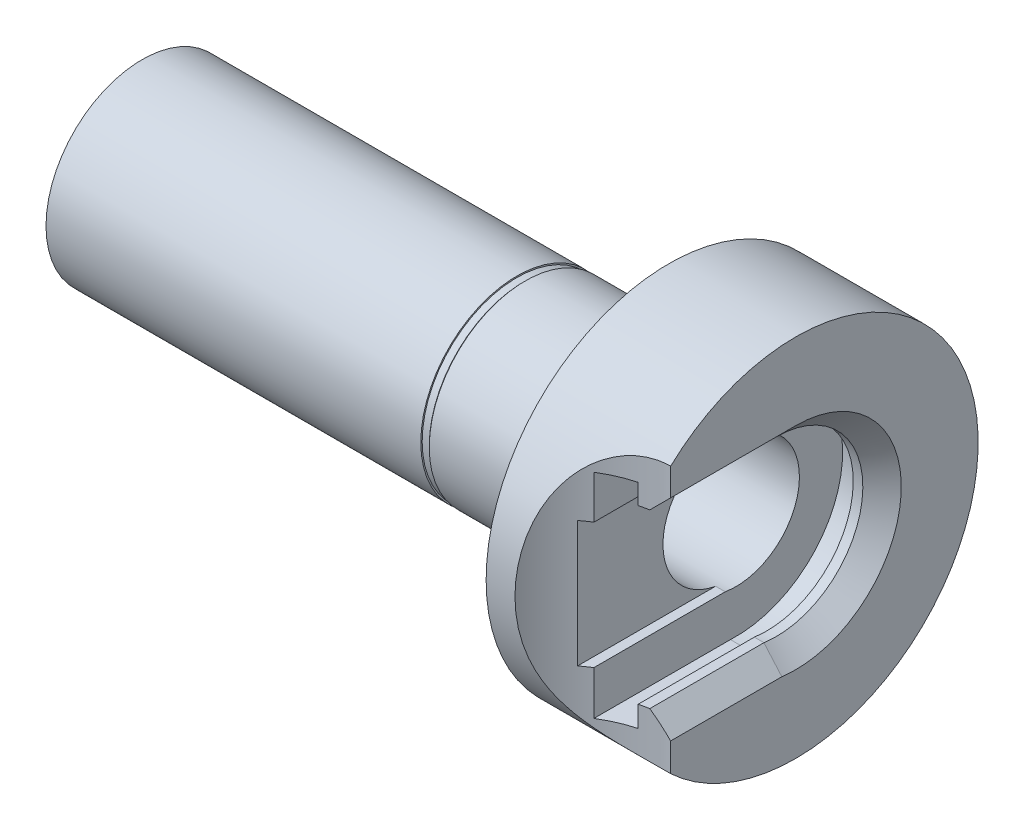
ISO-10303-21;
HEADER;
FILE_DESCRIPTION(('STEP AP214'),'2;1');
FILE_NAME('part.step','',(''),(''),'','','');
FILE_SCHEMA(('AUTOMOTIVE_DESIGN { 1 0 10303 214 1 1 1 1 }'));
ENDSEC;
DATA;
#1=APPLICATION_CONTEXT('core data for automotive mechanical design processes');
#2=APPLICATION_PROTOCOL_DEFINITION('international standard','automotive_design',2000,#1);
#3=PRODUCT_CONTEXT('',#1,'mechanical');
#4=PRODUCT('Part','Part','',(#3));
#5=PRODUCT_RELATED_PRODUCT_CATEGORY('part','',(#4));
#6=PRODUCT_DEFINITION_FORMATION('','',#4);
#7=PRODUCT_DEFINITION_CONTEXT('part definition',#1,'design');
#8=PRODUCT_DEFINITION('design','',#6,#7);
#9=PRODUCT_DEFINITION_SHAPE('','',#8);
#10=(LENGTH_UNIT() NAMED_UNIT(*) SI_UNIT(.MILLI.,.METRE.));
#11=(NAMED_UNIT(*) PLANE_ANGLE_UNIT() SI_UNIT($,.RADIAN.));
#12=(NAMED_UNIT(*) SI_UNIT($,.STERADIAN.) SOLID_ANGLE_UNIT());
#13=UNCERTAINTY_MEASURE_WITH_UNIT(LENGTH_MEASURE(1.E-05),#10,'distance_accuracy_value','');
#14=(GEOMETRIC_REPRESENTATION_CONTEXT(3) GLOBAL_UNCERTAINTY_ASSIGNED_CONTEXT((#13)) GLOBAL_UNIT_ASSIGNED_CONTEXT((#10,
#11,#12)) REPRESENTATION_CONTEXT('',''));
#15=CARTESIAN_POINT('',(0.,0.,0.));
#16=DIRECTION('',(0.,0.,1.));
#17=DIRECTION('',(1.,0.,0.));
#18=AXIS2_PLACEMENT_3D('',#15,#16,#17);
#19=CARTESIAN_POINT('',(0.,0.,0.));
#20=DIRECTION('',(-1.,0.,0.));
#21=DIRECTION('',(0.,0.,1.));
#22=AXIS2_PLACEMENT_3D('',#19,#20,#21);
#23=CYLINDRICAL_SURFACE('',#22,5.);
#24=CARTESIAN_POINT('',(20.5154591039939,0.,0.));
#25=DIRECTION('',(-1.,0.,0.));
#26=DIRECTION('',(0.,0.,1.));
#27=AXIS2_PLACEMENT_3D('',#24,#25,#26);
#28=CIRCLE('',#27,5.);
#29=CARTESIAN_POINT('',(20.5154591039939,0.,4.99999999999999));
#30=VERTEX_POINT('',#29);
#31=EDGE_CURVE('E188',#30,#30,#28,.T.);
#32=ORIENTED_EDGE('',*,*,#31,.T.);
#33=EDGE_LOOP('',(#32));
#34=FACE_BOUND('',#33,.T.);
#35=CARTESIAN_POINT('',(1.0154591039939,0.,0.));
#36=DIRECTION('',(-1.,0.,0.));
#37=DIRECTION('',(0.,0.,1.));
#38=AXIS2_PLACEMENT_3D('',#35,#36,#37);
#39=CIRCLE('',#38,5.);
#40=CARTESIAN_POINT('',(1.01545910399391,0.,5.));
#41=VERTEX_POINT('',#40);
#42=EDGE_CURVE('E210',#41,#41,#39,.T.);
#43=ORIENTED_EDGE('',*,*,#42,.F.);
#44=EDGE_LOOP('',(#43));
#45=FACE_BOUND('',#44,.T.);
#46=ADVANCED_FACE('F40',(#34,#45),#23,.T.);
#47=CARTESIAN_POINT('',(0.,0.,0.));
#48=DIRECTION('',(-1.,0.,0.));
#49=DIRECTION('',(0.,0.,1.));
#50=AXIS2_PLACEMENT_3D('',#47,#48,#49);
#51=CYLINDRICAL_SURFACE('',#50,3.3);
#52=CARTESIAN_POINT('',(31.4154591039939,0.,0.));
#53=DIRECTION('',(-1.,0.,0.));
#54=DIRECTION('',(0.,0.,1.));
#55=AXIS2_PLACEMENT_3D('',#52,#53,#54);
#56=CIRCLE('',#55,3.3);
#57=CARTESIAN_POINT('',(31.4154591039939,3.29999999999999,0.));
#58=VERTEX_POINT('',#57);
#59=CARTESIAN_POINT('',(31.4154591039939,-3.25202991374689,0.560625935981721));
#60=VERTEX_POINT('',#59);
#61=EDGE_CURVE('E211',#58,#60,#56,.F.);
#62=ORIENTED_EDGE('',*,*,#61,.T.);
#63=DIRECTION('',(-1.,0.,0.));
#64=VECTOR('',#63,1.);
#65=CARTESIAN_POINT('',(0.,-3.25202991374689,0.560625935981729));
#66=LINE('',#65,#64);
#67=CARTESIAN_POINT('',(31.9154591039939,-3.25202991374689,0.560625935981698));
#68=VERTEX_POINT('',#67);
#69=EDGE_CURVE('E378',#60,#68,#66,.F.);
#70=ORIENTED_EDGE('',*,*,#69,.T.);
#71=CARTESIAN_POINT('',(31.9154591039939,0.,0.));
#72=DIRECTION('',(-1.,0.,0.));
#73=DIRECTION('',(0.,0.,1.));
#74=AXIS2_PLACEMENT_3D('',#71,#72,#73);
#75=CIRCLE('',#74,3.29999999999999);
#76=CARTESIAN_POINT('',(31.9154591039939,3.29999999999999,0.));
#77=VERTEX_POINT('',#76);
#78=EDGE_CURVE('E185',#77,#68,#75,.T.);
#79=ORIENTED_EDGE('',*,*,#78,.F.);
#80=DIRECTION('',(1.,0.,0.));
#81=VECTOR('',#80,1.);
#82=CARTESIAN_POINT('',(31.4154591039939,3.29999999999999,0.));
#83=LINE('',#82,#81);
#84=EDGE_CURVE('E381',#58,#77,#83,.T.);
#85=ORIENTED_EDGE('',*,*,#84,.F.);
#86=EDGE_LOOP('',(#62,#70,#79,#85));
#87=FACE_BOUND('',#86,.T.);
#88=CARTESIAN_POINT('',(1.0154591039939,0.,0.));
#89=DIRECTION('',(-1.,0.,0.));
#90=DIRECTION('',(0.,0.,1.));
#91=AXIS2_PLACEMENT_3D('',#88,#89,#90);
#92=CIRCLE('',#91,3.3);
#93=CARTESIAN_POINT('',(1.0154591039939,0.,3.3));
#94=VERTEX_POINT('',#93);
#95=EDGE_CURVE('E207',#94,#94,#92,.F.);
#96=ORIENTED_EDGE('',*,*,#95,.F.);
#97=EDGE_LOOP('',(#96));
#98=FACE_BOUND('',#97,.T.);
#99=ADVANCED_FACE('F247',(#87,#98),#51,.F.);
#100=CARTESIAN_POINT('',(0.,0.,0.));
#101=DIRECTION('',(-1.,0.,0.));
#102=DIRECTION('',(0.,0.,1.));
#103=AXIS2_PLACEMENT_3D('',#100,#101,#102);
#104=CYLINDRICAL_SURFACE('',#103,9.50000000000001);
#105=CARTESIAN_POINT('',(35.0154591039939,0.,0.));
#106=DIRECTION('',(-1.,0.,0.));
#107=DIRECTION('',(0.,0.,1.));
#108=AXIS2_PLACEMENT_3D('',#105,#106,#107);
#109=CIRCLE('',#108,9.5);
#110=CARTESIAN_POINT('',(35.0154591039939,6.92820323027551,6.49999999999999));
#111=VERTEX_POINT('',#110);
#112=CARTESIAN_POINT('',(35.0154591039939,-6.92820323027551,6.49999999999999));
#113=VERTEX_POINT('',#112);
#114=EDGE_CURVE('E163',#111,#113,#109,.T.);
#115=ORIENTED_EDGE('',*,*,#114,.T.);
#116=CARTESIAN_POINT('',(35.0154591039939,-6.92820323027552,6.49999999999999));
#117=CARTESIAN_POINT('',(34.8926678035359,-6.92820097522638,6.49997491642782));
#118=CARTESIAN_POINT('',(34.7698798374619,-6.9245669471852,6.50387499498328));
#119=CARTESIAN_POINT('',(34.5252360059488,-6.91001843317508,6.51934455292043));
#120=CARTESIAN_POINT('',(34.4033800307692,-6.89910481814345,6.53091311483582));
#121=CARTESIAN_POINT('',(34.1617852477066,-6.87001507756581,6.56150214854152));
#122=CARTESIAN_POINT('',(34.0420420708314,-6.85185639567211,6.58050471964451));
#123=CARTESIAN_POINT('',(33.8052521130669,-6.80825185871371,6.62560911023437));
#124=CARTESIAN_POINT('',(33.688205314328,-6.78280605190359,6.651710882711));
#125=CARTESIAN_POINT('',(33.457632713507,-6.72460960192344,6.71053901593543));
#126=CARTESIAN_POINT('',(33.3441073166604,-6.6918581215582,6.74326613587657));
#127=CARTESIAN_POINT('',(33.1213298637619,-6.61904985797065,6.81474731606241));
#128=CARTESIAN_POINT('',(33.0120794485026,-6.57899030257755,6.85350366254827));
#129=CARTESIAN_POINT('',(32.7986526369085,-6.49165009359089,6.93628820094963));
#130=CARTESIAN_POINT('',(32.6944737358211,-6.44437305333062,6.98031375254166));
#131=CARTESIAN_POINT('',(32.4916959264218,-6.34267979014135,7.07284530805727));
#132=CARTESIAN_POINT('',(32.393099048115,-6.28826099355188,7.12135292530005));
#133=CARTESIAN_POINT('',(32.201317778799,-6.17205581600124,7.22230438836257));
#134=CARTESIAN_POINT('',(32.1081770166241,-6.11021964605491,7.27477384561933));
#135=CARTESIAN_POINT('',(31.9284089042353,-5.9797570779866,7.38239036984795));
#136=CARTESIAN_POINT('',(31.8417842354552,-5.91112791109525,7.43753852393173));
#137=CARTESIAN_POINT('',(31.5920567309495,-5.69549052094308,7.60554935519937));
#138=CARTESIAN_POINT('',(31.4389736108417,-5.538655294023,7.72104727832139));
#139=CARTESIAN_POINT('',(31.2231117818283,-5.27856555833108,7.89932442279438));
#140=CARTESIAN_POINT('',(31.1507762168951,-5.18310755059406,7.96235167768399));
#141=CARTESIAN_POINT('',(31.0139138547261,-4.98598529059379,8.08724491490436));
#142=CARTESIAN_POINT('',(30.9493873596567,-4.88432079840371,8.14911085222051));
#143=CARTESIAN_POINT('',(30.8277835796292,-4.67537020651557,8.27076454030899));
#144=CARTESIAN_POINT('',(30.7707107083948,-4.56808082821614,8.33055104449395));
#145=CARTESIAN_POINT('',(30.6635889709392,-4.34852805959572,8.44723444541919));
#146=CARTESIAN_POINT('',(30.613541403054,-4.23626375489656,8.50413080679989));
#147=CARTESIAN_POINT('',(30.4981005432869,-3.95381570979288,8.64014222498236));
#148=CARTESIAN_POINT('',(30.4364722249317,-3.78109203122208,8.71720858906235));
#149=CARTESIAN_POINT('',(30.3256662293798,-3.42790842993084,8.86204942659279));
#150=CARTESIAN_POINT('',(30.27649319281,-3.24744565294968,8.92982043245097));
#151=CARTESIAN_POINT('',(30.1890251817398,-2.88014038643488,9.05497006925718));
#152=CARTESIAN_POINT('',(30.1507438215469,-2.69329023663,9.11233566154735));
#153=CARTESIAN_POINT('',(30.0837970091572,-2.31483446155291,9.2157489903258));
#154=CARTESIAN_POINT('',(30.0551307650347,-2.12322922931824,9.26179765882146));
#155=CARTESIAN_POINT('',(30.0059623846874,-1.73374676416473,9.34260354416896));
#156=CARTESIAN_POINT('',(29.985581974345,-1.53581910270169,9.37719111569914));
#157=CARTESIAN_POINT('',(29.9527223593948,-1.13753200318231,9.43379487294162));
#158=CARTESIAN_POINT('',(29.9402432487223,-0.937172536244111,9.45581090919589));
#159=CARTESIAN_POINT('',(29.9226414089353,-0.535103162538625,9.48706121379255));
#160=CARTESIAN_POINT('',(29.9175200266342,-0.333393015319889,9.49629314202566));
#161=CARTESIAN_POINT('',(29.9144112592919,0.0702658420147457,9.50188477301532));
#162=CARTESIAN_POINT('',(29.9164243009932,0.27221456567872,9.49824370577939));
#163=CARTESIAN_POINT('',(29.9284739860873,0.70407137498536,9.47667900181425));
#164=CARTESIAN_POINT('',(29.939615250478,0.933854349180326,9.45679023947337));
#165=CARTESIAN_POINT('',(29.9719654441124,1.39071485032967,9.40047303062734));
#166=CARTESIAN_POINT('',(29.9931761473495,1.61779189333495,9.36404166976287));
#167=CARTESIAN_POINT('',(30.0468308797863,2.06736249545983,9.27515458814839));
#168=CARTESIAN_POINT('',(30.0792705882359,2.289857782731,9.22270503186848));
#169=CARTESIAN_POINT('',(30.1570605557154,2.72837365477471,9.10261497277848));
#170=CARTESIAN_POINT('',(30.2024064917762,2.94439638081209,9.03497955810382));
#171=CARTESIAN_POINT('',(30.2951133106242,3.31566076288988,8.90421537344618));
#172=CARTESIAN_POINT('',(30.3392304164498,3.47277434722823,8.84407566031832));
#173=CARTESIAN_POINT('',(30.4370462741509,3.78103666035063,8.71673940836563));
#174=CARTESIAN_POINT('',(30.4907428898352,3.9321867098207,8.64954444420444));
#175=CARTESIAN_POINT('',(30.6087269980874,4.22720022417962,8.50925519043395));
#176=CARTESIAN_POINT('',(30.6730005608683,4.37107295172493,8.43616872364191));
#177=CARTESIAN_POINT('',(30.813236122544,4.65049177424564,8.28541522951158));
#178=CARTESIAN_POINT('',(30.8891958998681,4.78603944499101,8.20774907450739));
#179=CARTESIAN_POINT('',(31.0382436257379,5.02294746159453,8.06445391203503));
#180=CARTESIAN_POINT('',(31.1091911756363,5.12594711194104,7.99930400084097));
#181=CARTESIAN_POINT('',(31.2597716486557,5.32494960600534,7.86823386072943));
#182=CARTESIAN_POINT('',(31.3394068590391,5.42095059598379,7.80231343305101));
#183=CARTESIAN_POINT('',(31.5074991110645,5.60521264834393,7.67100954905795));
#184=CARTESIAN_POINT('',(31.5959522213243,5.69347712728688,7.60562586738839));
#185=CARTESIAN_POINT('',(31.7816498015532,5.86167499554453,7.47676318150066));
#186=CARTESIAN_POINT('',(31.8788902103771,5.94161219699895,7.41328331529802));
#187=CARTESIAN_POINT('',(32.0826154564416,6.09319589962933,7.28921288621872));
#188=CARTESIAN_POINT('',(32.1891573612127,6.16478385929563,7.22864429389313));
#189=CARTESIAN_POINT('',(32.4104102054315,6.29865191424135,7.11230298035672));
#190=CARTESIAN_POINT('',(32.5251212135577,6.36093193125437,7.0565302994743));
#191=CARTESIAN_POINT('',(32.7619713651722,6.47592267343285,6.95115201632213));
#192=CARTESIAN_POINT('',(32.8841117458982,6.52863179886988,6.90154744545819));
#193=CARTESIAN_POINT('',(33.1348219768588,6.62431352018289,6.80976282941281));
#194=CARTESIAN_POINT('',(33.2633912998399,6.66728691291711,6.76758217665551));
#195=CARTESIAN_POINT('',(33.5225396728066,6.74249463542762,6.69264665917227));
#196=CARTESIAN_POINT('',(33.6529880915548,6.77497061622167,6.65968248470449));
#197=CARTESIAN_POINT('',(33.9177448885382,6.83062724508595,6.60258379451609));
#198=CARTESIAN_POINT('',(34.0520532091518,6.85380803183993,6.57844914705993));
#199=CARTESIAN_POINT('',(34.3238557091232,6.8909863009935,6.53950149818154));
#200=CARTESIAN_POINT('',(34.4613609060765,6.90494477639979,6.52472810205396));
#201=CARTESIAN_POINT('',(34.7377281479466,6.92355257415097,6.50495573736465));
#202=CARTESIAN_POINT('',(34.8765904949649,6.92819977408823,6.49995899729526));
#203=CARTESIAN_POINT('',(35.0154591039938,6.92820323027594,6.49999999999992));
#204=B_SPLINE_CURVE_WITH_KNOTS('',3,(#116,#117,#118,#119,#120,#121,#122,#123,#124,#125,#126,
#127,#128,#129,#130,#131,#132,#133,#134,#135,#136,#137,#138,#139,#140,#141,#142,#143,#144,#145,
#146,#147,#148,#149,#150,#151,#152,#153,#154,#155,#156,#157,#158,#159,#160,#161,#162,#163,#164,
#165,#166,#167,#168,#169,#170,#171,#172,#173,#174,#175,#176,#177,#178,#179,#180,#181,#182,#183,
#184,#185,#186,#187,#188,#189,#190,#191,#192,#193,#194,#195,#196,#197,#198,#199,#200,#201,#202,
#203),.UNSPECIFIED.,.F.,.F.,(4,2,2,2,2,2,2,2,2,2,2,2,2,2,2,2,2,2,2,2,2,2,2,2,2,2,2,2,2,2,2,2,2,
2,2,2,2,2,2,2,2,2,2,4),(0.,0.368253323737548,0.736462597167675,1.10379064672168,
1.47111626392389,1.83848399652776,2.20599137352814,2.57331536280809,2.94077208926313,
3.31085015310959,3.68107968376728,4.42105311303094,4.82678586234217,5.23253430618952,
5.6385219382433,6.04458450176569,6.64049281430209,7.23662282667027,7.83349474456473,
8.43031749047518,9.03561613568075,9.64092197689388,10.2463386036743,10.851791443793,
11.5436948456076,12.2357201894458,12.9274795479304,13.619007472238,14.1403073991708,
14.6614912233446,15.181994065033,15.7023980801713,16.125055723833,16.5478249133712,
16.9704064509026,17.3927936769794,17.8179840574777,18.2431780130136,18.6684429723826,
19.0936731117307,19.5082708732369,19.9228624487392,20.3391965558011,20.7556255510667),.UNSPECIFIED.);
#205=EDGE_CURVE('E148',#113,#111,#204,.T.);
#206=ORIENTED_EDGE('',*,*,#205,.T.);
#207=EDGE_LOOP('',(#115,#206));
#208=FACE_BOUND('',#207,.T.);
#209=CARTESIAN_POINT('',(28.4154591039939,0.,0.));
#210=DIRECTION('',(-1.,0.,0.));
#211=DIRECTION('',(0.,0.,1.));
#212=AXIS2_PLACEMENT_3D('',#209,#210,#211);
#213=CIRCLE('',#212,9.50000000000001);
#214=CARTESIAN_POINT('',(28.4154591039939,0.,9.5));
#215=VERTEX_POINT('',#214);
#216=EDGE_CURVE('E197',#215,#215,#213,.T.);
#217=ORIENTED_EDGE('',*,*,#216,.F.);
#218=EDGE_LOOP('',(#217));
#219=FACE_BOUND('',#218,.T.);
#220=ADVANCED_FACE('F168',(#208,#219),#104,.T.);
#221=CARTESIAN_POINT('',(33.5154591039939,0.,-5.55000000000001));
#222=DIRECTION('',(1.,0.,0.));
#223=DIRECTION('',(0.,0.,-1.));
#224=AXIS2_PLACEMENT_3D('',#221,#222,#223);
#225=PLANE('',#224);
#226=DIRECTION('',(0.,0.,-1.));
#227=VECTOR('',#226,1.);
#228=CARTESIAN_POINT('',(33.5154591039939,-5.54245325423287,0.));
#229=LINE('',#228,#227);
#230=CARTESIAN_POINT('',(33.5154591039939,-5.54245325423288,6.69609718118852));
#231=VERTEX_POINT('',#230);
#232=CARTESIAN_POINT('',(33.5154591039939,-5.54245325423287,0.289330130894481));
#233=VERTEX_POINT('',#232);
#234=EDGE_CURVE('E358',#231,#233,#229,.T.);
#235=ORIENTED_EDGE('',*,*,#234,.F.);
#236=DIRECTION('',(0.,1.,0.));
#237=VECTOR('',#236,1.);
#238=CARTESIAN_POINT('',(33.5154591039939,-9.50000000000001,6.69609718118852));
#239=LINE('',#238,#237);
#240=CARTESIAN_POINT('',(33.5154591039939,-4.45323015215794,6.69609718118852));
#241=VERTEX_POINT('',#240);
#242=EDGE_CURVE('E406',#231,#241,#239,.T.);
#243=ORIENTED_EDGE('',*,*,#242,.T.);
#244=DIRECTION('',(0.,0.,1.));
#245=VECTOR('',#244,1.);
#246=CARTESIAN_POINT('',(33.5154591039939,-4.45323015215794,-5.55000000000001));
#247=LINE('',#246,#245);
#248=CARTESIAN_POINT('',(33.5154591039939,-4.45323015215794,0.647102164971961));
#249=VERTEX_POINT('',#248);
#250=EDGE_CURVE('E355',#249,#241,#247,.T.);
#251=ORIENTED_EDGE('',*,*,#250,.F.);
#252=CARTESIAN_POINT('',(33.5154591039939,0.,0.));
#253=DIRECTION('',(-1.,0.,0.));
#254=DIRECTION('',(0.,0.,1.));
#255=AXIS2_PLACEMENT_3D('',#252,#253,#254);
#256=CIRCLE('',#255,4.5);
#257=CARTESIAN_POINT('',(33.5154591039939,4.5,0.));
#258=VERTEX_POINT('',#257);
#259=EDGE_CURVE('E170',#258,#249,#256,.T.);
#260=ORIENTED_EDGE('',*,*,#259,.F.);
#261=DIRECTION('',(0.,0.,-1.));
#262=VECTOR('',#261,1.);
#263=CARTESIAN_POINT('',(33.5154591039939,4.5,-5.55000000000001));
#264=LINE('',#263,#262);
#265=CARTESIAN_POINT('',(33.5154591039939,4.5,6.69609718118852));
#266=VERTEX_POINT('',#265);
#267=EDGE_CURVE('E350',#266,#258,#264,.T.);
#268=ORIENTED_EDGE('',*,*,#267,.F.);
#269=CARTESIAN_POINT('',(33.5154591039939,5.54941976914797,6.69609718118852));
#270=VERTEX_POINT('',#269);
#271=EDGE_CURVE('E402',#266,#270,#239,.T.);
#272=ORIENTED_EDGE('',*,*,#271,.T.);
#273=DIRECTION('',(0.,0.,1.));
#274=VECTOR('',#273,1.);
#275=CARTESIAN_POINT('',(33.5154591039939,5.54941976914797,0.));
#276=LINE('',#275,#274);
#277=CARTESIAN_POINT('',(33.5154591039939,5.54941976914797,0.0802510173747677));
#278=VERTEX_POINT('',#277);
#279=EDGE_CURVE('E352',#278,#270,#276,.T.);
#280=ORIENTED_EDGE('',*,*,#279,.F.);
#281=CARTESIAN_POINT('',(33.5154591039939,0.,0.));
#282=DIRECTION('',(-1.,0.,0.));
#283=DIRECTION('',(0.,0.,1.));
#284=AXIS2_PLACEMENT_3D('',#281,#282,#283);
#285=CIRCLE('',#284,5.55);
#286=EDGE_CURVE('E174',#278,#233,#285,.T.);
#287=ORIENTED_EDGE('',*,*,#286,.T.);
#288=EDGE_LOOP('',(#235,#243,#251,#260,#268,#272,#280,#287));
#289=FACE_BOUND('',#288,.T.);
#290=ADVANCED_FACE('F278',(#289),#225,.F.);
#291=CARTESIAN_POINT('',(0.,0.,0.));
#292=DIRECTION('',(-1.,0.,0.));
#293=DIRECTION('',(0.,0.,1.));
#294=AXIS2_PLACEMENT_3D('',#291,#292,#293);
#295=CYLINDRICAL_SURFACE('',#294,4.5);
#296=DIRECTION('',(-1.,0.,0.));
#297=VECTOR('',#296,1.);
#298=CARTESIAN_POINT('',(0.,-4.45323015215794,0.647102164971969));
#299=LINE('',#298,#297);
#300=CARTESIAN_POINT('',(34.0154591039939,-4.45323015215794,0.647102164971961));
#301=VERTEX_POINT('',#300);
#302=EDGE_CURVE('E370',#301,#249,#299,.T.);
#303=ORIENTED_EDGE('',*,*,#302,.F.);
#304=CARTESIAN_POINT('',(34.0154591039939,0.,0.));
#305=DIRECTION('',(-1.,0.,0.));
#306=DIRECTION('',(0.,0.,1.));
#307=AXIS2_PLACEMENT_3D('',#304,#305,#306);
#308=CIRCLE('',#307,4.5);
#309=CARTESIAN_POINT('',(34.0154591039939,4.5,0.));
#310=VERTEX_POINT('',#309);
#311=EDGE_CURVE('E49',#301,#310,#308,.F.);
#312=ORIENTED_EDGE('',*,*,#311,.T.);
#313=DIRECTION('',(-1.,0.,0.));
#314=VECTOR('',#313,1.);
#315=CARTESIAN_POINT('',(35.9154591039939,4.5,0.));
#316=LINE('',#315,#314);
#317=EDGE_CURVE('E372',#310,#258,#316,.T.);
#318=ORIENTED_EDGE('',*,*,#317,.T.);
#319=ORIENTED_EDGE('',*,*,#259,.T.);
#320=EDGE_LOOP('',(#303,#312,#318,#319));
#321=FACE_BOUND('',#320,.T.);
#322=ADVANCED_FACE('F326',(#321),#295,.F.);
#323=CARTESIAN_POINT('',(35.0154591039939,0.,-4.50000000000001));
#324=DIRECTION('',(-1.,0.,0.));
#325=DIRECTION('',(0.,0.,1.));
#326=AXIS2_PLACEMENT_3D('',#323,#324,#325);
#327=PLANE('',#326);
#328=CARTESIAN_POINT('',(35.0154591039939,0.,0.));
#329=DIRECTION('',(-1.,0.,0.));
#330=DIRECTION('',(0.,0.,1.));
#331=AXIS2_PLACEMENT_3D('',#328,#329,#330);
#332=CIRCLE('',#331,5.50000000000001);
#333=CARTESIAN_POINT('',(35.0154591039939,5.50000000000001,0.));
#334=VERTEX_POINT('',#333);
#335=CARTESIAN_POINT('',(35.0154591039939,-5.45323015215794,0.715738016033472));
#336=VERTEX_POINT('',#335);
#337=EDGE_CURVE('E222',#334,#336,#332,.T.);
#338=ORIENTED_EDGE('',*,*,#337,.T.);
#339=DIRECTION('',(0.,0.,1.));
#340=VECTOR('',#339,1.);
#341=CARTESIAN_POINT('',(35.0154591039939,-5.45323015215794,6.49999999999999));
#342=LINE('',#341,#340);
#343=CARTESIAN_POINT('',(35.0154591039939,-5.45323015215794,6.49999999999999));
#344=VERTEX_POINT('',#343);
#345=EDGE_CURVE('E165',#336,#344,#342,.T.);
#346=ORIENTED_EDGE('',*,*,#345,.T.);
#347=DIRECTION('',(0.,1.,0.));
#348=VECTOR('',#347,1.);
#349=CARTESIAN_POINT('',(35.0154591039939,-9.50000000000001,6.49999999999999));
#350=LINE('',#349,#348);
#351=EDGE_CURVE('E151',#113,#344,#350,.T.);
#352=ORIENTED_EDGE('',*,*,#351,.F.);
#353=ORIENTED_EDGE('',*,*,#114,.F.);
#354=CARTESIAN_POINT('',(35.0154591039939,5.50000000000001,6.49999999999999));
#355=VERTEX_POINT('',#354);
#356=EDGE_CURVE('E154',#355,#111,#350,.T.);
#357=ORIENTED_EDGE('',*,*,#356,.F.);
#358=DIRECTION('',(0.,0.,-1.));
#359=VECTOR('',#358,1.);
#360=CARTESIAN_POINT('',(35.0154591039939,5.50000000000001,0.));
#361=LINE('',#360,#359);
#362=EDGE_CURVE('E220',#355,#334,#361,.T.);
#363=ORIENTED_EDGE('',*,*,#362,.T.);
#364=EDGE_LOOP('',(#338,#346,#352,#353,#357,#363));
#365=FACE_BOUND('',#364,.T.);
#366=ADVANCED_FACE('F162',(#365),#327,.F.);
#367=CARTESIAN_POINT('',(0.,0.,0.));
#368=DIRECTION('',(-1.,0.,0.));
#369=DIRECTION('',(0.,0.,1.));
#370=AXIS2_PLACEMENT_3D('',#367,#368,#369);
#371=CYLINDRICAL_SURFACE('',#370,5.55);
#372=DIRECTION('',(-1.,0.,0.));
#373=VECTOR('',#372,1.);
#374=CARTESIAN_POINT('',(0.,5.54941976914797,0.0802510173747759));
#375=LINE('',#374,#373);
#376=CARTESIAN_POINT('',(31.9154591039939,5.54941976914797,0.0802510173747681));
#377=VERTEX_POINT('',#376);
#378=EDGE_CURVE('E171',#377,#278,#375,.F.);
#379=ORIENTED_EDGE('',*,*,#378,.F.);
#380=CARTESIAN_POINT('',(31.9154591039939,0.,0.));
#381=DIRECTION('',(-1.,0.,0.));
#382=DIRECTION('',(0.,0.,1.));
#383=AXIS2_PLACEMENT_3D('',#380,#381,#382);
#384=CIRCLE('',#383,5.55);
#385=CARTESIAN_POINT('',(31.9154591039939,-5.54245325423287,0.289330130894481));
#386=VERTEX_POINT('',#385);
#387=EDGE_CURVE('E182',#377,#386,#384,.T.);
#388=ORIENTED_EDGE('',*,*,#387,.T.);
#389=DIRECTION('',(-1.,0.,0.));
#390=VECTOR('',#389,1.);
#391=CARTESIAN_POINT('',(0.,-5.54245325423287,0.289330130894489));
#392=LINE('',#391,#390);
#393=EDGE_CURVE('E176',#233,#386,#392,.T.);
#394=ORIENTED_EDGE('',*,*,#393,.F.);
#395=ORIENTED_EDGE('',*,*,#286,.F.);
#396=EDGE_LOOP('',(#379,#388,#394,#395));
#397=FACE_BOUND('',#396,.T.);
#398=ADVANCED_FACE('F274',(#397),#371,.F.);
#399=CARTESIAN_POINT('',(28.4154591039939,0.,-9.50000000000001));
#400=DIRECTION('',(1.,0.,0.));
#401=DIRECTION('',(0.,0.,-1.));
#402=AXIS2_PLACEMENT_3D('',#399,#400,#401);
#403=PLANE('',#402);
#404=CARTESIAN_POINT('',(28.4154591039939,0.,0.));
#405=DIRECTION('',(-1.,0.,0.));
#406=DIRECTION('',(0.,0.,1.));
#407=AXIS2_PLACEMENT_3D('',#404,#405,#406);
#408=CIRCLE('',#407,5.);
#409=CARTESIAN_POINT('',(28.4154591039939,0.,4.99999999999999));
#410=VERTEX_POINT('',#409);
#411=EDGE_CURVE('E194',#410,#410,#408,.T.);
#412=ORIENTED_EDGE('',*,*,#411,.F.);
#413=EDGE_LOOP('',(#412));
#414=FACE_BOUND('',#413,.T.);
#415=ORIENTED_EDGE('',*,*,#216,.T.);
#416=EDGE_LOOP('',(#415));
#417=FACE_BOUND('',#416,.T.);
#418=ADVANCED_FACE('F270',(#414,#417),#403,.F.);
#419=CARTESIAN_POINT('',(0.,0.,0.));
#420=DIRECTION('',(-1.,0.,0.));
#421=DIRECTION('',(0.,0.,1.));
#422=AXIS2_PLACEMENT_3D('',#419,#420,#421);
#423=CYLINDRICAL_SURFACE('',#422,5.);
#424=CARTESIAN_POINT('',(20.9561214704841,0.,0.));
#425=DIRECTION('',(1.,0.,0.));
#426=DIRECTION('',(0.,0.,-1.));
#427=AXIS2_PLACEMENT_3D('',#424,#425,#426);
#428=CIRCLE('',#427,5.);
#429=CARTESIAN_POINT('',(20.9561214704841,0.,-5.));
#430=VERTEX_POINT('',#429);
#431=EDGE_CURVE('E200',#430,#430,#428,.T.);
#432=ORIENTED_EDGE('',*,*,#431,.T.);
#433=EDGE_LOOP('',(#432));
#434=FACE_BOUND('',#433,.T.);
#435=ORIENTED_EDGE('',*,*,#411,.T.);
#436=EDGE_LOOP('',(#435));
#437=FACE_BOUND('',#436,.T.);
#438=ADVANCED_FACE('F266',(#434,#437),#423,.T.);
#439=CARTESIAN_POINT('',(0.,0.,0.));
#440=DIRECTION('',(-1.,0.,0.));
#441=DIRECTION('',(0.,0.,1.));
#442=AXIS2_PLACEMENT_3D('',#439,#440,#441);
#443=CYLINDRICAL_SURFACE('',#442,4.92860420354376);
#444=CARTESIAN_POINT('',(20.8847256740279,0.,0.));
#445=DIRECTION('',(1.,0.,0.));
#446=DIRECTION('',(0.,0.,-1.));
#447=AXIS2_PLACEMENT_3D('',#444,#445,#446);
#448=CIRCLE('',#447,4.92860420354376);
#449=CARTESIAN_POINT('',(20.8847256740279,0.,-4.92860420354376));
#450=VERTEX_POINT('',#449);
#451=EDGE_CURVE('E203',#450,#450,#448,.F.);
#452=ORIENTED_EDGE('',*,*,#451,.T.);
#453=EDGE_LOOP('',(#452));
#454=FACE_BOUND('',#453,.T.);
#455=CARTESIAN_POINT('',(20.5154591039939,0.,0.));
#456=DIRECTION('',(-1.,0.,0.));
#457=DIRECTION('',(0.,0.,1.));
#458=AXIS2_PLACEMENT_3D('',#455,#456,#457);
#459=CIRCLE('',#458,4.92860420354376);
#460=CARTESIAN_POINT('',(20.5154591039939,0.,4.92860420354375));
#461=VERTEX_POINT('',#460);
#462=EDGE_CURVE('E191',#461,#461,#459,.T.);
#463=ORIENTED_EDGE('',*,*,#462,.F.);
#464=EDGE_LOOP('',(#463));
#465=FACE_BOUND('',#464,.T.);
#466=ADVANCED_FACE('F262',(#454,#465),#443,.T.);
#467=CARTESIAN_POINT('',(20.5154591039939,0.,-5.00000000000001));
#468=DIRECTION('',(-1.,0.,0.));
#469=DIRECTION('',(0.,0.,1.));
#470=AXIS2_PLACEMENT_3D('',#467,#468,#469);
#471=PLANE('',#470);
#472=ORIENTED_EDGE('',*,*,#31,.F.);
#473=EDGE_LOOP('',(#472));
#474=FACE_BOUND('',#473,.T.);
#475=ORIENTED_EDGE('',*,*,#462,.T.);
#476=EDGE_LOOP('',(#475));
#477=FACE_BOUND('',#476,.T.);
#478=ADVANCED_FACE('F258',(#474,#477),#471,.F.);
#479=CARTESIAN_POINT('',(31.9154591039939,0.,-3.3));
#480=DIRECTION('',(-1.,0.,0.));
#481=DIRECTION('',(0.,0.,1.));
#482=AXIS2_PLACEMENT_3D('',#479,#480,#481);
#483=PLANE('',#482);
#484=DIRECTION('',(0.,0.,1.));
#485=VECTOR('',#484,1.);
#486=CARTESIAN_POINT('',(31.9154591039939,5.54941976914797,0.));
#487=LINE('',#486,#485);
#488=CARTESIAN_POINT('',(31.9154591039939,5.54941976914797,7.3915978314525));
#489=VERTEX_POINT('',#488);
#490=EDGE_CURVE('E343',#377,#489,#487,.T.);
#491=ORIENTED_EDGE('',*,*,#490,.T.);
#492=DIRECTION('',(0.,1.,0.));
#493=VECTOR('',#492,1.);
#494=CARTESIAN_POINT('',(31.9154591039939,-9.50000000000001,7.3915978314525));
#495=LINE('',#494,#493);
#496=CARTESIAN_POINT('',(31.9154591039939,3.29999999999999,7.3915978314525));
#497=VERTEX_POINT('',#496);
#498=EDGE_CURVE('E345',#489,#497,#495,.F.);
#499=ORIENTED_EDGE('',*,*,#498,.T.);
#500=DIRECTION('',(0.,0.,1.));
#501=VECTOR('',#500,1.);
#502=CARTESIAN_POINT('',(31.9154591039939,3.29999999999999,0.));
#503=LINE('',#502,#501);
#504=EDGE_CURVE('E158',#77,#497,#503,.T.);
#505=ORIENTED_EDGE('',*,*,#504,.F.);
#506=ORIENTED_EDGE('',*,*,#78,.T.);
#507=DIRECTION('',(0.,0.,1.));
#508=VECTOR('',#507,1.);
#509=CARTESIAN_POINT('',(31.9154591039939,-3.25202991374689,-3.3));
#510=LINE('',#509,#508);
#511=CARTESIAN_POINT('',(31.9154591039939,-3.25202991374689,7.3915978314525));
#512=VERTEX_POINT('',#511);
#513=EDGE_CURVE('E206',#68,#512,#510,.T.);
#514=ORIENTED_EDGE('',*,*,#513,.T.);
#515=CARTESIAN_POINT('',(31.9154591039939,-5.54245325423288,7.3915978314525));
#516=VERTEX_POINT('',#515);
#517=EDGE_CURVE('E393',#512,#516,#495,.F.);
#518=ORIENTED_EDGE('',*,*,#517,.T.);
#519=DIRECTION('',(0.,0.,-1.));
#520=VECTOR('',#519,1.);
#521=CARTESIAN_POINT('',(31.9154591039939,-5.54245325423287,0.));
#522=LINE('',#521,#520);
#523=EDGE_CURVE('E349',#516,#386,#522,.T.);
#524=ORIENTED_EDGE('',*,*,#523,.T.);
#525=ORIENTED_EDGE('',*,*,#387,.F.);
#526=EDGE_LOOP('',(#491,#499,#505,#506,#514,#518,#524,#525));
#527=FACE_BOUND('',#526,.T.);
#528=ADVANCED_FACE('F261',(#527),#483,.F.);
#529=CARTESIAN_POINT('',(20.7561214704841,0.,0.));
#530=DIRECTION('',(1.,0.,0.));
#531=DIRECTION('',(0.,0.,-1.));
#532=AXIS2_PLACEMENT_3D('',#529,#530,#531);
#533=CONICAL_SURFACE('',#532,4.8,0.78539816339745);
#534=ORIENTED_EDGE('',*,*,#431,.F.);
#535=EDGE_LOOP('',(#534));
#536=FACE_BOUND('',#535,.T.);
#537=ORIENTED_EDGE('',*,*,#451,.F.);
#538=EDGE_LOOP('',(#537));
#539=FACE_BOUND('',#538,.T.);
#540=ADVANCED_FACE('F279',(#536,#539),#533,.T.);
#541=CARTESIAN_POINT('',(33.5154591039939,5.54941976914797,0.));
#542=DIRECTION('',(0.,-1.,0.));
#543=DIRECTION('',(0.,0.,-1.));
#544=AXIS2_PLACEMENT_3D('',#541,#542,#543);
#545=PLANE('',#544);
#546=CARTESIAN_POINT('',(35.0154591039939,5.54941976914797,12.335));
#547=DIRECTION('',(0.,-1.,0.));
#548=DIRECTION('',(0.,0.,-1.));
#549=AXIS2_PLACEMENT_3D('',#546,#547,#548);
#550=CIRCLE('',#549,5.83499999999999);
#551=EDGE_CURVE('E396',#489,#270,#550,.T.);
#552=ORIENTED_EDGE('',*,*,#551,.F.);
#553=ORIENTED_EDGE('',*,*,#490,.F.);
#554=ORIENTED_EDGE('',*,*,#378,.T.);
#555=ORIENTED_EDGE('',*,*,#279,.T.);
#556=EDGE_LOOP('',(#552,#553,#554,#555));
#557=FACE_BOUND('',#556,.T.);
#558=ADVANCED_FACE('F319',(#557),#545,.T.);
#559=CARTESIAN_POINT('',(33.5154591039939,-5.54245325423287,0.));
#560=DIRECTION('',(0.,1.,0.));
#561=DIRECTION('',(0.,0.,1.));
#562=AXIS2_PLACEMENT_3D('',#559,#560,#561);
#563=PLANE('',#562);
#564=CARTESIAN_POINT('',(35.0154591039939,-5.54245325423288,12.335));
#565=DIRECTION('',(0.,1.,0.));
#566=DIRECTION('',(0.,0.,1.));
#567=AXIS2_PLACEMENT_3D('',#564,#565,#566);
#568=CIRCLE('',#567,5.83499999999999);
#569=EDGE_CURVE('E407',#231,#516,#568,.T.);
#570=ORIENTED_EDGE('',*,*,#569,.F.);
#571=ORIENTED_EDGE('',*,*,#234,.T.);
#572=ORIENTED_EDGE('',*,*,#393,.T.);
#573=ORIENTED_EDGE('',*,*,#523,.F.);
#574=EDGE_LOOP('',(#570,#571,#572,#573));
#575=FACE_BOUND('',#574,.T.);
#576=ADVANCED_FACE('F313',(#575),#563,.T.);
#577=CARTESIAN_POINT('',(35.9154591039939,-4.45323015215794,0.));
#578=DIRECTION('',(0.,1.,0.));
#579=DIRECTION('',(0.,0.,1.));
#580=AXIS2_PLACEMENT_3D('',#577,#578,#579);
#581=PLANE('',#580);
#582=CARTESIAN_POINT('',(35.0154591039939,-4.45323015215794,12.335));
#583=DIRECTION('',(0.,1.,0.));
#584=DIRECTION('',(0.,0.,1.));
#585=AXIS2_PLACEMENT_3D('',#582,#583,#584);
#586=CIRCLE('',#585,5.83499999999999);
#587=CARTESIAN_POINT('',(34.0154591039939,-4.45323015215794,6.58632841432039));
#588=VERTEX_POINT('',#587);
#589=EDGE_CURVE('E159',#588,#241,#586,.T.);
#590=ORIENTED_EDGE('',*,*,#589,.F.);
#591=DIRECTION('',(0.,0.,-1.));
#592=VECTOR('',#591,1.);
#593=CARTESIAN_POINT('',(34.0154591039939,-4.45323015215794,0.647102164971956));
#594=LINE('',#593,#592);
#595=EDGE_CURVE('E217',#588,#301,#594,.T.);
#596=ORIENTED_EDGE('',*,*,#595,.T.);
#597=ORIENTED_EDGE('',*,*,#302,.T.);
#598=ORIENTED_EDGE('',*,*,#250,.T.);
#599=EDGE_LOOP('',(#590,#596,#597,#598));
#600=FACE_BOUND('',#599,.T.);
#601=ADVANCED_FACE('F310',(#600),#581,.T.);
#602=CARTESIAN_POINT('',(35.9154591039939,4.5,0.));
#603=DIRECTION('',(0.,-1.,0.));
#604=DIRECTION('',(0.,0.,-1.));
#605=AXIS2_PLACEMENT_3D('',#602,#603,#604);
#606=PLANE('',#605);
#607=ORIENTED_EDGE('',*,*,#317,.F.);
#608=DIRECTION('',(0.,0.,1.));
#609=VECTOR('',#608,1.);
#610=CARTESIAN_POINT('',(34.0154591039939,4.5,6.49999999999999));
#611=LINE('',#610,#609);
#612=CARTESIAN_POINT('',(34.0154591039939,4.5,6.58632841432039));
#613=VERTEX_POINT('',#612);
#614=EDGE_CURVE('E11',#310,#613,#611,.T.);
#615=ORIENTED_EDGE('',*,*,#614,.T.);
#616=CARTESIAN_POINT('',(35.0154591039939,4.5,12.335));
#617=DIRECTION('',(0.,-1.,0.));
#618=DIRECTION('',(0.,0.,-1.));
#619=AXIS2_PLACEMENT_3D('',#616,#617,#618);
#620=CIRCLE('',#619,5.83499999999999);
#621=EDGE_CURVE('E405',#266,#613,#620,.T.);
#622=ORIENTED_EDGE('',*,*,#621,.F.);
#623=ORIENTED_EDGE('',*,*,#267,.T.);
#624=EDGE_LOOP('',(#607,#615,#622,#623));
#625=FACE_BOUND('',#624,.T.);
#626=ADVANCED_FACE('F308',(#625),#606,.T.);
#627=CARTESIAN_POINT('',(1.0154591039939,0.,0.));
#628=DIRECTION('',(-1.,0.,0.));
#629=DIRECTION('',(0.,0.,1.));
#630=AXIS2_PLACEMENT_3D('',#627,#628,#629);
#631=PLANE('',#630);
#632=ORIENTED_EDGE('',*,*,#95,.T.);
#633=EDGE_LOOP('',(#632));
#634=FACE_BOUND('',#633,.T.);
#635=ORIENTED_EDGE('',*,*,#42,.T.);
#636=EDGE_LOOP('',(#635));
#637=FACE_BOUND('',#636,.T.);
#638=ADVANCED_FACE('F298',(#634,#637),#631,.T.);
#639=CARTESIAN_POINT('',(31.4154591039939,0.,0.));
#640=DIRECTION('',(-1.,0.,0.));
#641=DIRECTION('',(0.,0.,1.));
#642=AXIS2_PLACEMENT_3D('',#639,#640,#641);
#643=PLANE('',#642);
#644=DIRECTION('',(0.,0.,1.));
#645=VECTOR('',#644,1.);
#646=CARTESIAN_POINT('',(31.4154591039939,3.29999999999999,0.));
#647=LINE('',#646,#645);
#648=CARTESIAN_POINT('',(31.4154591039939,3.29999999999999,7.74291713924933));
#649=VERTEX_POINT('',#648);
#650=EDGE_CURVE('E288',#58,#649,#647,.T.);
#651=ORIENTED_EDGE('',*,*,#650,.T.);
#652=DIRECTION('',(0.,1.,0.));
#653=VECTOR('',#652,1.);
#654=CARTESIAN_POINT('',(31.4154591039939,-9.50000000000001,7.74291713924933));
#655=LINE('',#654,#653);
#656=CARTESIAN_POINT('',(31.4154591039939,-3.25202991374689,7.74291713924933));
#657=VERTEX_POINT('',#656);
#658=EDGE_CURVE('E166',#649,#657,#655,.F.);
#659=ORIENTED_EDGE('',*,*,#658,.T.);
#660=DIRECTION('',(0.,0.,-1.));
#661=VECTOR('',#660,1.);
#662=CARTESIAN_POINT('',(31.4154591039939,-3.25202991374689,0.));
#663=LINE('',#662,#661);
#664=EDGE_CURVE('E383',#657,#60,#663,.T.);
#665=ORIENTED_EDGE('',*,*,#664,.T.);
#666=ORIENTED_EDGE('',*,*,#61,.F.);
#667=EDGE_LOOP('',(#651,#659,#665,#666));
#668=FACE_BOUND('',#667,.T.);
#669=ADVANCED_FACE('F294',(#668),#643,.F.);
#670=CARTESIAN_POINT('',(31.4154591039939,-3.25202991374689,0.));
#671=DIRECTION('',(0.,-1.,0.));
#672=DIRECTION('',(0.,0.,-1.));
#673=AXIS2_PLACEMENT_3D('',#670,#671,#672);
#674=PLANE('',#673);
#675=ORIENTED_EDGE('',*,*,#664,.F.);
#676=CARTESIAN_POINT('',(35.0154591039939,-3.25202991374689,12.335));
#677=DIRECTION('',(0.,-1.,0.));
#678=DIRECTION('',(0.,0.,-1.));
#679=AXIS2_PLACEMENT_3D('',#676,#677,#678);
#680=CIRCLE('',#679,5.83499999999999);
#681=EDGE_CURVE('E395',#657,#512,#680,.T.);
#682=ORIENTED_EDGE('',*,*,#681,.T.);
#683=ORIENTED_EDGE('',*,*,#513,.F.);
#684=ORIENTED_EDGE('',*,*,#69,.F.);
#685=EDGE_LOOP('',(#675,#682,#683,#684));
#686=FACE_BOUND('',#685,.T.);
#687=ADVANCED_FACE('F297',(#686),#674,.F.);
#688=CARTESIAN_POINT('',(31.4154591039939,3.29999999999999,0.));
#689=DIRECTION('',(0.,1.,0.));
#690=DIRECTION('',(0.,0.,1.));
#691=AXIS2_PLACEMENT_3D('',#688,#689,#690);
#692=PLANE('',#691);
#693=ORIENTED_EDGE('',*,*,#504,.T.);
#694=CARTESIAN_POINT('',(35.0154591039939,3.29999999999999,12.335));
#695=DIRECTION('',(0.,1.,0.));
#696=DIRECTION('',(0.,0.,1.));
#697=AXIS2_PLACEMENT_3D('',#694,#695,#696);
#698=CIRCLE('',#697,5.83499999999999);
#699=EDGE_CURVE('E214',#497,#649,#698,.T.);
#700=ORIENTED_EDGE('',*,*,#699,.T.);
#701=ORIENTED_EDGE('',*,*,#650,.F.);
#702=ORIENTED_EDGE('',*,*,#84,.T.);
#703=EDGE_LOOP('',(#693,#700,#701,#702));
#704=FACE_BOUND('',#703,.T.);
#705=ADVANCED_FACE('F293',(#704),#692,.F.);
#706=CARTESIAN_POINT('',(35.0154591039939,-9.50000000000001,12.335));
#707=DIRECTION('',(0.,1.,0.));
#708=DIRECTION('',(0.,0.,1.));
#709=AXIS2_PLACEMENT_3D('',#706,#707,#708);
#710=CYLINDRICAL_SURFACE('',#709,5.83499999999999);
#711=ORIENTED_EDGE('',*,*,#351,.T.);
#712=CARTESIAN_POINT('',(35.0154591039939,-5.45323015215794,12.335));
#713=DIRECTION('',(0.70710678118655,0.707106781186545,0.));
#714=DIRECTION('',(-0.707106781186545,0.70710678118655,0.));
#715=AXIS2_PLACEMENT_3D('',#712,#713,#714);
#716=ELLIPSE('',#715,8.25193613644703,5.83499999999999);
#717=EDGE_CURVE('E227',#344,#588,#716,.T.);
#718=ORIENTED_EDGE('',*,*,#717,.T.);
#719=ORIENTED_EDGE('',*,*,#589,.T.);
#720=ORIENTED_EDGE('',*,*,#242,.F.);
#721=ORIENTED_EDGE('',*,*,#569,.T.);
#722=ORIENTED_EDGE('',*,*,#517,.F.);
#723=ORIENTED_EDGE('',*,*,#681,.F.);
#724=ORIENTED_EDGE('',*,*,#658,.F.);
#725=ORIENTED_EDGE('',*,*,#699,.F.);
#726=ORIENTED_EDGE('',*,*,#498,.F.);
#727=ORIENTED_EDGE('',*,*,#551,.T.);
#728=ORIENTED_EDGE('',*,*,#271,.F.);
#729=ORIENTED_EDGE('',*,*,#621,.T.);
#730=CARTESIAN_POINT('',(35.0154591039939,5.5,12.335));
#731=DIRECTION('',(0.70710678118655,-0.707106781186545,0.));
#732=DIRECTION('',(0.707106781186545,0.70710678118655,0.));
#733=AXIS2_PLACEMENT_3D('',#730,#731,#732);
#734=ELLIPSE('',#733,8.25193613644703,5.83499999999999);
#735=EDGE_CURVE('E225',#613,#355,#734,.T.);
#736=ORIENTED_EDGE('',*,*,#735,.T.);
#737=ORIENTED_EDGE('',*,*,#356,.T.);
#738=ORIENTED_EDGE('',*,*,#205,.F.);
#739=EDGE_LOOP('',(#711,#718,#719,#720,#721,#722,#723,#724,#725,#726,#727,#728,#729,#736,#737,#738));
#740=FACE_BOUND('',#739,.T.);
#741=ADVANCED_FACE('F150',(#740),#710,.F.);
#742=CARTESIAN_POINT('',(34.0154591039939,4.5,0.));
#743=DIRECTION('',(0.70710678118655,-0.707106781186545,0.));
#744=DIRECTION('',(0.,0.,-1.));
#745=AXIS2_PLACEMENT_3D('',#742,#743,#744);
#746=PLANE('',#745);
#747=ORIENTED_EDGE('',*,*,#735,.F.);
#748=ORIENTED_EDGE('',*,*,#614,.F.);
#749=DIRECTION('',(-0.707106781186545,-0.70710678118655,0.));
#750=VECTOR('',#749,1.);
#751=CARTESIAN_POINT('',(35.0154591039939,5.50000000000001,0.));
#752=LINE('',#751,#750);
#753=EDGE_CURVE('E44',#334,#310,#752,.T.);
#754=ORIENTED_EDGE('',*,*,#753,.F.);
#755=ORIENTED_EDGE('',*,*,#362,.F.);
#756=EDGE_LOOP('',(#747,#748,#754,#755));
#757=FACE_BOUND('',#756,.T.);
#758=ADVANCED_FACE('F42',(#757),#746,.T.);
#759=CARTESIAN_POINT('',(35.0154591039939,0.,0.));
#760=DIRECTION('',(1.,0.,0.));
#761=DIRECTION('',(0.,0.,-1.));
#762=AXIS2_PLACEMENT_3D('',#759,#760,#761);
#763=CONICAL_SURFACE('',#762,5.50000000000001,0.785398163397452);
#764=ORIENTED_EDGE('',*,*,#753,.T.);
#765=ORIENTED_EDGE('',*,*,#311,.F.);
#766=CARTESIAN_POINT('',(34.0154591039939,-4.45323015215794,0.647102164971961));
#767=CARTESIAN_POINT('',(34.1821060833981,-4.61987713156211,0.659115869778187));
#768=CARTESIAN_POINT('',(34.3487629188192,-4.7865339669832,0.670842377243746));
#769=CARTESIAN_POINT('',(34.6820962521584,-5.11986730032239,0.693720994093528));
#770=CARTESIAN_POINT('',(34.8487727500706,-5.28654379823464,0.704873103648474));
#771=CARTESIAN_POINT('',(35.0154591039939,-5.45323015215794,0.715738016033474));
#772=B_SPLINE_CURVE_WITH_KNOTS('',3,(#766,#767,#768,#769,#770,#771),.UNSPECIFIED.,.F.,.F.,(4,2,
4),(0.,0.707939695922152,1.41587918142989),.UNSPECIFIED.);
#773=EDGE_CURVE('E229',#336,#301,#772,.F.);
#774=ORIENTED_EDGE('',*,*,#773,.F.);
#775=ORIENTED_EDGE('',*,*,#337,.F.);
#776=EDGE_LOOP('',(#764,#765,#774,#775));
#777=FACE_BOUND('',#776,.T.);
#778=ADVANCED_FACE('F235',(#777),#763,.F.);
#779=CARTESIAN_POINT('',(34.0154591039939,-4.45323015215794,0.));
#780=DIRECTION('',(0.70710678118655,0.707106781186545,0.));
#781=DIRECTION('',(0.,0.,1.));
#782=AXIS2_PLACEMENT_3D('',#779,#780,#781);
#783=PLANE('',#782);
#784=ORIENTED_EDGE('',*,*,#717,.F.);
#785=ORIENTED_EDGE('',*,*,#345,.F.);
#786=ORIENTED_EDGE('',*,*,#773,.T.);
#787=ORIENTED_EDGE('',*,*,#595,.F.);
#788=EDGE_LOOP('',(#784,#785,#786,#787));
#789=FACE_BOUND('',#788,.T.);
#790=ADVANCED_FACE('F238',(#789),#783,.T.);
#791=CLOSED_SHELL('',(#46,#99,#220,#290,#322,#366,#398,#418,#438,#466,#478,#528,#540,#558,#576,
#601,#626,#638,#669,#687,#705,#741,#758,#778,#790));
#792=MANIFOLD_SOLID_BREP('B2',#791);
#793=ADVANCED_BREP_SHAPE_REPRESENTATION('',(#18,#792),#14);
#794=SHAPE_DEFINITION_REPRESENTATION(#9,#793);
ENDSEC;
END-ISO-10303-21;
